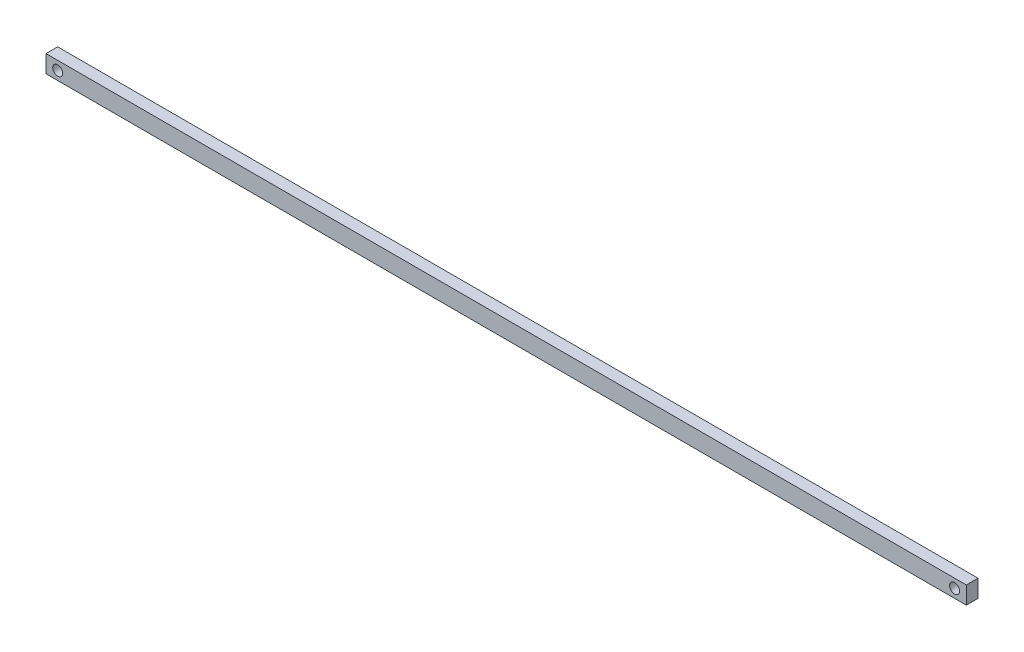
ISO-10303-21;
HEADER;
FILE_DESCRIPTION(('STEP AP214'),'2;1');
FILE_NAME('part.step','',(''),(''),'','','');
FILE_SCHEMA(('AUTOMOTIVE_DESIGN { 1 0 10303 214 1 1 1 1 }'));
ENDSEC;
DATA;
#1=APPLICATION_CONTEXT('core data for automotive mechanical design processes');
#2=APPLICATION_PROTOCOL_DEFINITION('international standard','automotive_design',2000,#1);
#3=PRODUCT_CONTEXT('',#1,'mechanical');
#4=PRODUCT('Part','Part','',(#3));
#5=PRODUCT_RELATED_PRODUCT_CATEGORY('part','',(#4));
#6=PRODUCT_DEFINITION_FORMATION('','',#4);
#7=PRODUCT_DEFINITION_CONTEXT('part definition',#1,'design');
#8=PRODUCT_DEFINITION('design','',#6,#7);
#9=PRODUCT_DEFINITION_SHAPE('','',#8);
#10=(LENGTH_UNIT() NAMED_UNIT(*) SI_UNIT(.MILLI.,.METRE.));
#11=(NAMED_UNIT(*) PLANE_ANGLE_UNIT() SI_UNIT($,.RADIAN.));
#12=(NAMED_UNIT(*) SI_UNIT($,.STERADIAN.) SOLID_ANGLE_UNIT());
#13=UNCERTAINTY_MEASURE_WITH_UNIT(LENGTH_MEASURE(1.E-05),#10,'distance_accuracy_value','');
#14=(GEOMETRIC_REPRESENTATION_CONTEXT(3) GLOBAL_UNCERTAINTY_ASSIGNED_CONTEXT((#13)) GLOBAL_UNIT_ASSIGNED_CONTEXT((#10,
#11,#12)) REPRESENTATION_CONTEXT('',''));
#15=CARTESIAN_POINT('',(0.,0.,0.));
#16=DIRECTION('',(0.,0.,1.));
#17=DIRECTION('',(1.,0.,0.));
#18=AXIS2_PLACEMENT_3D('',#15,#16,#17);
#19=CARTESIAN_POINT('',(0.,0.,10.));
#20=DIRECTION('',(1.,0.,0.));
#21=DIRECTION('',(0.,0.,-1.));
#22=AXIS2_PLACEMENT_3D('',#19,#20,#21);
#23=PLANE('',#22);
#24=DIRECTION('',(0.,-1.,0.));
#25=VECTOR('',#24,1.);
#26=CARTESIAN_POINT('',(0.,0.,0.));
#27=LINE('',#26,#25);
#28=CARTESIAN_POINT('',(0.,15.,0.));
#29=VERTEX_POINT('',#28);
#30=CARTESIAN_POINT('',(0.,0.,0.));
#31=VERTEX_POINT('',#30);
#32=EDGE_CURVE('E112',#29,#31,#27,.T.);
#33=ORIENTED_EDGE('',*,*,#32,.T.);
#34=DIRECTION('',(0.,0.,-1.));
#35=VECTOR('',#34,1.);
#36=CARTESIAN_POINT('',(0.,0.,10.));
#37=LINE('',#36,#35);
#38=CARTESIAN_POINT('',(0.,0.,10.));
#39=VERTEX_POINT('',#38);
#40=EDGE_CURVE('E11',#39,#31,#37,.T.);
#41=ORIENTED_EDGE('',*,*,#40,.F.);
#42=DIRECTION('',(0.,-1.,0.));
#43=VECTOR('',#42,1.);
#44=CARTESIAN_POINT('',(0.,0.,10.));
#45=LINE('',#44,#43);
#46=CARTESIAN_POINT('',(0.,15.,10.));
#47=VERTEX_POINT('',#46);
#48=EDGE_CURVE('E96',#47,#39,#45,.T.);
#49=ORIENTED_EDGE('',*,*,#48,.F.);
#50=DIRECTION('',(0.,0.,-1.));
#51=VECTOR('',#50,1.);
#52=CARTESIAN_POINT('',(0.,15.,10.));
#53=LINE('',#52,#51);
#54=EDGE_CURVE('E108',#47,#29,#53,.T.);
#55=ORIENTED_EDGE('',*,*,#54,.T.);
#56=EDGE_LOOP('',(#33,#41,#49,#55));
#57=FACE_BOUND('',#56,.T.);
#58=ADVANCED_FACE('F44',(#57),#23,.F.);
#59=CARTESIAN_POINT('',(0.,0.,10.));
#60=DIRECTION('',(0.,1.,0.));
#61=DIRECTION('',(0.,0.,1.));
#62=AXIS2_PLACEMENT_3D('',#59,#60,#61);
#63=PLANE('',#62);
#64=DIRECTION('',(1.,0.,0.));
#65=VECTOR('',#64,1.);
#66=CARTESIAN_POINT('',(0.,0.,0.));
#67=LINE('',#66,#65);
#68=CARTESIAN_POINT('',(788.,0.,0.));
#69=VERTEX_POINT('',#68);
#70=EDGE_CURVE('E101',#31,#69,#67,.T.);
#71=ORIENTED_EDGE('',*,*,#70,.T.);
#72=DIRECTION('',(0.,0.,-1.));
#73=VECTOR('',#72,1.);
#74=CARTESIAN_POINT('',(788.,0.,10.));
#75=LINE('',#74,#73);
#76=CARTESIAN_POINT('',(788.,0.,10.));
#77=VERTEX_POINT('',#76);
#78=EDGE_CURVE('E53',#77,#69,#75,.T.);
#79=ORIENTED_EDGE('',*,*,#78,.F.);
#80=DIRECTION('',(1.,0.,0.));
#81=VECTOR('',#80,1.);
#82=CARTESIAN_POINT('',(0.,0.,10.));
#83=LINE('',#82,#81);
#84=EDGE_CURVE('E91',#39,#77,#83,.T.);
#85=ORIENTED_EDGE('',*,*,#84,.F.);
#86=ORIENTED_EDGE('',*,*,#40,.T.);
#87=EDGE_LOOP('',(#71,#79,#85,#86));
#88=FACE_BOUND('',#87,.T.);
#89=ADVANCED_FACE('F100',(#88),#63,.F.);
#90=CARTESIAN_POINT('',(788.,0.,10.));
#91=DIRECTION('',(-1.,0.,0.));
#92=DIRECTION('',(0.,0.,1.));
#93=AXIS2_PLACEMENT_3D('',#90,#91,#92);
#94=PLANE('',#93);
#95=DIRECTION('',(0.,1.,0.));
#96=VECTOR('',#95,1.);
#97=CARTESIAN_POINT('',(788.,0.,0.));
#98=LINE('',#97,#96);
#99=CARTESIAN_POINT('',(788.,15.,0.));
#100=VERTEX_POINT('',#99);
#101=EDGE_CURVE('E78',#69,#100,#98,.T.);
#102=ORIENTED_EDGE('',*,*,#101,.T.);
#103=DIRECTION('',(0.,0.,-1.));
#104=VECTOR('',#103,1.);
#105=CARTESIAN_POINT('',(788.,15.,10.));
#106=LINE('',#105,#104);
#107=CARTESIAN_POINT('',(788.,15.,10.));
#108=VERTEX_POINT('',#107);
#109=EDGE_CURVE('E103',#108,#100,#106,.T.);
#110=ORIENTED_EDGE('',*,*,#109,.F.);
#111=DIRECTION('',(0.,1.,0.));
#112=VECTOR('',#111,1.);
#113=CARTESIAN_POINT('',(788.,0.,10.));
#114=LINE('',#113,#112);
#115=EDGE_CURVE('E94',#77,#108,#114,.T.);
#116=ORIENTED_EDGE('',*,*,#115,.F.);
#117=ORIENTED_EDGE('',*,*,#78,.T.);
#118=EDGE_LOOP('',(#102,#110,#116,#117));
#119=FACE_BOUND('',#118,.T.);
#120=ADVANCED_FACE('F104',(#119),#94,.F.);
#121=CARTESIAN_POINT('',(0.,15.,10.));
#122=DIRECTION('',(0.,-1.,0.));
#123=DIRECTION('',(0.,0.,-1.));
#124=AXIS2_PLACEMENT_3D('',#121,#122,#123);
#125=PLANE('',#124);
#126=DIRECTION('',(-1.,0.,0.));
#127=VECTOR('',#126,1.);
#128=CARTESIAN_POINT('',(0.,15.,0.));
#129=LINE('',#128,#127);
#130=EDGE_CURVE('E84',#100,#29,#129,.T.);
#131=ORIENTED_EDGE('',*,*,#130,.T.);
#132=ORIENTED_EDGE('',*,*,#54,.F.);
#133=DIRECTION('',(-1.,0.,0.));
#134=VECTOR('',#133,1.);
#135=CARTESIAN_POINT('',(0.,15.,10.));
#136=LINE('',#135,#134);
#137=EDGE_CURVE('E61',#108,#47,#136,.T.);
#138=ORIENTED_EDGE('',*,*,#137,.F.);
#139=ORIENTED_EDGE('',*,*,#109,.T.);
#140=EDGE_LOOP('',(#131,#132,#138,#139));
#141=FACE_BOUND('',#140,.T.);
#142=ADVANCED_FACE('F126',(#141),#125,.F.);
#143=CARTESIAN_POINT('',(0.,0.,10.));
#144=DIRECTION('',(0.,0.,-1.));
#145=DIRECTION('',(-1.,0.,0.));
#146=AXIS2_PLACEMENT_3D('',#143,#144,#145);
#147=PLANE('',#146);
#148=CARTESIAN_POINT('',(10.,7.5,10.));
#149=DIRECTION('',(0.,0.,1.));
#150=DIRECTION('',(1.,0.,0.));
#151=AXIS2_PLACEMENT_3D('',#148,#149,#150);
#152=CIRCLE('',#151,4.255);
#153=CARTESIAN_POINT('',(14.255,7.5,10.));
#154=VERTEX_POINT('',#153);
#155=EDGE_CURVE('E137',#154,#154,#152,.T.);
#156=ORIENTED_EDGE('',*,*,#155,.F.);
#157=EDGE_LOOP('',(#156));
#158=FACE_BOUND('',#157,.T.);
#159=CARTESIAN_POINT('',(778.,7.5,10.));
#160=DIRECTION('',(0.,0.,1.));
#161=DIRECTION('',(1.,0.,0.));
#162=AXIS2_PLACEMENT_3D('',#159,#160,#161);
#163=CIRCLE('',#162,4.255);
#164=CARTESIAN_POINT('',(782.255,7.5,10.));
#165=VERTEX_POINT('',#164);
#166=EDGE_CURVE('E133',#165,#165,#163,.T.);
#167=ORIENTED_EDGE('',*,*,#166,.F.);
#168=EDGE_LOOP('',(#167));
#169=FACE_BOUND('',#168,.T.);
#170=ORIENTED_EDGE('',*,*,#48,.T.);
#171=ORIENTED_EDGE('',*,*,#84,.T.);
#172=ORIENTED_EDGE('',*,*,#115,.T.);
#173=ORIENTED_EDGE('',*,*,#137,.T.);
#174=EDGE_LOOP('',(#170,#171,#172,#173));
#175=FACE_BOUND('',#174,.T.);
#176=ADVANCED_FACE('F92',(#158,#169,#175),#147,.F.);
#177=CARTESIAN_POINT('',(0.,0.,0.));
#178=DIRECTION('',(0.,0.,-1.));
#179=DIRECTION('',(-1.,0.,0.));
#180=AXIS2_PLACEMENT_3D('',#177,#178,#179);
#181=PLANE('',#180);
#182=CARTESIAN_POINT('',(10.,7.5,0.));
#183=DIRECTION('',(0.,0.,-1.));
#184=DIRECTION('',(-1.,0.,0.));
#185=AXIS2_PLACEMENT_3D('',#182,#183,#184);
#186=CIRCLE('',#185,4.255);
#187=CARTESIAN_POINT('',(5.745,7.5,0.));
#188=VERTEX_POINT('',#187);
#189=EDGE_CURVE('E116',#188,#188,#186,.F.);
#190=ORIENTED_EDGE('',*,*,#189,.T.);
#191=EDGE_LOOP('',(#190));
#192=FACE_BOUND('',#191,.T.);
#193=CARTESIAN_POINT('',(778.,7.5,0.));
#194=DIRECTION('',(0.,0.,-1.));
#195=DIRECTION('',(-1.,0.,0.));
#196=AXIS2_PLACEMENT_3D('',#193,#194,#195);
#197=CIRCLE('',#196,4.255);
#198=CARTESIAN_POINT('',(773.745,7.5,0.));
#199=VERTEX_POINT('',#198);
#200=EDGE_CURVE('E138',#199,#199,#197,.F.);
#201=ORIENTED_EDGE('',*,*,#200,.T.);
#202=EDGE_LOOP('',(#201));
#203=FACE_BOUND('',#202,.T.);
#204=ORIENTED_EDGE('',*,*,#32,.F.);
#205=ORIENTED_EDGE('',*,*,#130,.F.);
#206=ORIENTED_EDGE('',*,*,#101,.F.);
#207=ORIENTED_EDGE('',*,*,#70,.F.);
#208=EDGE_LOOP('',(#204,#205,#206,#207));
#209=FACE_BOUND('',#208,.T.);
#210=ADVANCED_FACE('F129',(#192,#203,#209),#181,.T.);
#211=CARTESIAN_POINT('',(778.,7.5,-12.034957415795));
#212=DIRECTION('',(0.,0.,1.));
#213=DIRECTION('',(1.,0.,0.));
#214=AXIS2_PLACEMENT_3D('',#211,#212,#213);
#215=CYLINDRICAL_SURFACE('',#214,4.255);
#216=ORIENTED_EDGE('',*,*,#166,.T.);
#217=EDGE_LOOP('',(#216));
#218=FACE_BOUND('',#217,.T.);
#219=ORIENTED_EDGE('',*,*,#200,.F.);
#220=EDGE_LOOP('',(#219));
#221=FACE_BOUND('',#220,.T.);
#222=ADVANCED_FACE('F157',(#218,#221),#215,.F.);
#223=CARTESIAN_POINT('',(10.,7.5,-12.034957415795));
#224=DIRECTION('',(0.,0.,1.));
#225=DIRECTION('',(1.,0.,0.));
#226=AXIS2_PLACEMENT_3D('',#223,#224,#225);
#227=CYLINDRICAL_SURFACE('',#226,4.255);
#228=ORIENTED_EDGE('',*,*,#155,.T.);
#229=EDGE_LOOP('',(#228));
#230=FACE_BOUND('',#229,.T.);
#231=ORIENTED_EDGE('',*,*,#189,.F.);
#232=EDGE_LOOP('',(#231));
#233=FACE_BOUND('',#232,.T.);
#234=ADVANCED_FACE('F149',(#230,#233),#227,.F.);
#235=CLOSED_SHELL('',(#58,#89,#120,#142,#176,#210,#222,#234));
#236=MANIFOLD_SOLID_BREP('B2',#235);
#237=ADVANCED_BREP_SHAPE_REPRESENTATION('',(#18,#236),#14);
#238=SHAPE_DEFINITION_REPRESENTATION(#9,#237);
ENDSEC;
END-ISO-10303-21;
